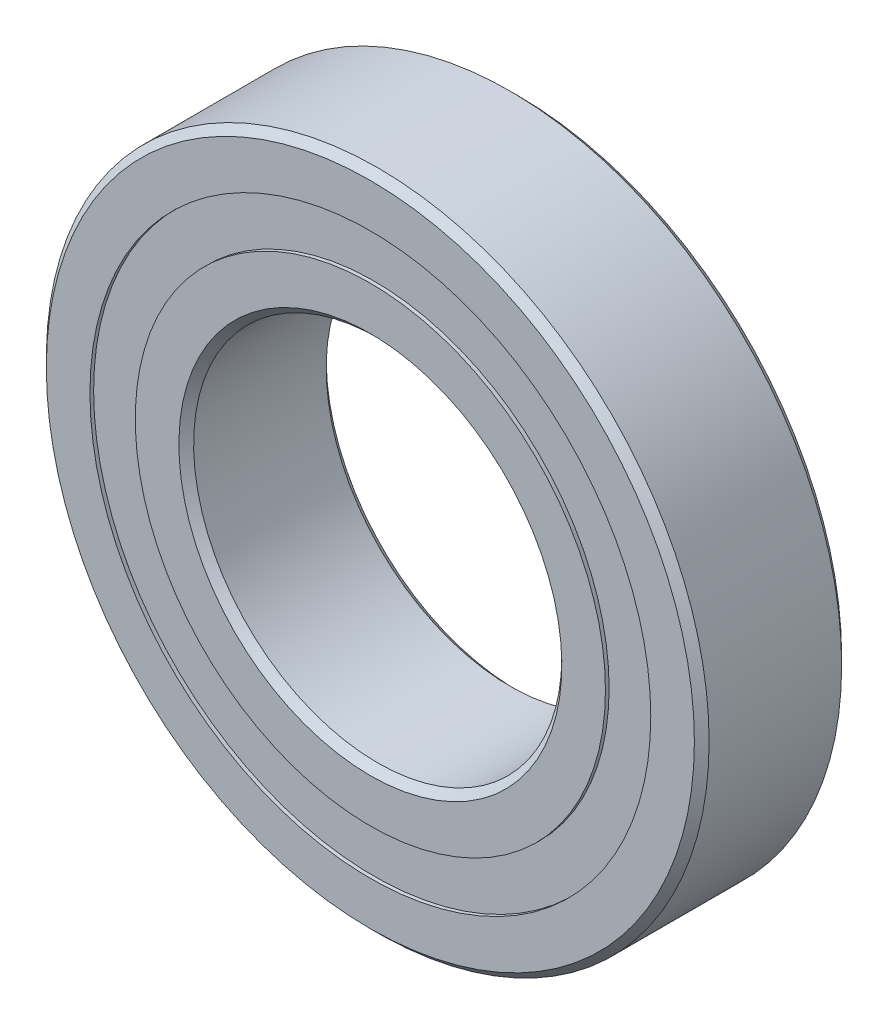
ISO-10303-21;
HEADER;
FILE_DESCRIPTION(('STEP AP214'),'2;1');
FILE_NAME('part.step','',(''),(''),'','','');
FILE_SCHEMA(('AUTOMOTIVE_DESIGN { 1 0 10303 214 1 1 1 1 }'));
ENDSEC;
DATA;
#1=APPLICATION_CONTEXT('core data for automotive mechanical design processes');
#2=APPLICATION_PROTOCOL_DEFINITION('international standard','automotive_design',2000,#1);
#3=PRODUCT_CONTEXT('',#1,'mechanical');
#4=PRODUCT('Part','Part','',(#3));
#5=PRODUCT_RELATED_PRODUCT_CATEGORY('part','',(#4));
#6=PRODUCT_DEFINITION_FORMATION('','',#4);
#7=PRODUCT_DEFINITION_CONTEXT('part definition',#1,'design');
#8=PRODUCT_DEFINITION('design','',#6,#7);
#9=PRODUCT_DEFINITION_SHAPE('','',#8);
#10=(LENGTH_UNIT() NAMED_UNIT(*) SI_UNIT(.MILLI.,.METRE.));
#11=(NAMED_UNIT(*) PLANE_ANGLE_UNIT() SI_UNIT($,.RADIAN.));
#12=(NAMED_UNIT(*) SI_UNIT($,.STERADIAN.) SOLID_ANGLE_UNIT());
#13=UNCERTAINTY_MEASURE_WITH_UNIT(LENGTH_MEASURE(1.E-05),#10,'distance_accuracy_value','');
#14=(GEOMETRIC_REPRESENTATION_CONTEXT(3) GLOBAL_UNCERTAINTY_ASSIGNED_CONTEXT((#13)) GLOBAL_UNIT_ASSIGNED_CONTEXT((#10,
#11,#12)) REPRESENTATION_CONTEXT('',''));
#15=CARTESIAN_POINT('',(0.,0.,0.));
#16=DIRECTION('',(0.,0.,1.));
#17=DIRECTION('',(1.,0.,0.));
#18=AXIS2_PLACEMENT_3D('',#15,#16,#17);
#19=CARTESIAN_POINT('',(-22.225,2.32794653101968E-13,0.));
#20=DIRECTION('',(-1.,0.,0.));
#21=DIRECTION('',(0.,0.,-1.));
#22=AXIS2_PLACEMENT_3D('',#19,#20,#21);
#23=SPHERICAL_SURFACE('',#22,3.43255780206311);
#24=CARTESIAN_POINT('',(-18.7924421979369,1.96840497746119E-13,0.));
#25=VERTEX_POINT('',#24);
#26=VERTEX_LOOP('',#25);
#27=FACE_BOUND('',#26,.T.);
#28=CARTESIAN_POINT('',(-25.6575578020631,2.68748808457817E-13,0.));
#29=VERTEX_POINT('',#28);
#30=VERTEX_LOOP('',#29);
#31=FACE_BOUND('',#30,.T.);
#32=ADVANCED_FACE('P0_F15',(#27,#31),#23,.T.);
#33=CLOSED_SHELL('',(#32));
#34=MANIFOLD_SOLID_BREP('P0_B1',#33);
#35=CARTESIAN_POINT('',(0.,24.1788461538462,-6.0325));
#36=DIRECTION('',(0.,0.,1.));
#37=DIRECTION('',(1.,0.,0.));
#38=AXIS2_PLACEMENT_3D('',#35,#36,#37);
#39=PLANE('',#38);
#40=CARTESIAN_POINT('',(0.,0.,-6.0325));
#41=DIRECTION('',(0.,0.,1.));
#42=DIRECTION('',(1.,0.,0.));
#43=AXIS2_PLACEMENT_3D('',#40,#41,#42);
#44=CIRCLE('',#43,20.2711538461538);
#45=CARTESIAN_POINT('',(20.2711538461538,0.,-6.0325));
#46=VERTEX_POINT('',#45);
#47=EDGE_CURVE('P1_E17',#46,#46,#44,.T.);
#48=ORIENTED_EDGE('',*,*,#47,.T.);
#49=EDGE_LOOP('',(#48));
#50=FACE_BOUND('',#49,.T.);
#51=CARTESIAN_POINT('',(0.,0.,-6.0325));
#52=DIRECTION('',(0.,0.,1.));
#53=DIRECTION('',(1.,0.,0.));
#54=AXIS2_PLACEMENT_3D('',#51,#52,#53);
#55=CIRCLE('',#54,24.1788461538462);
#56=CARTESIAN_POINT('',(24.1788461538462,0.,-6.0325));
#57=VERTEX_POINT('',#56);
#58=EDGE_CURVE('P1_E26',#57,#57,#55,.T.);
#59=ORIENTED_EDGE('',*,*,#58,.F.);
#60=EDGE_LOOP('',(#59));
#61=FACE_BOUND('',#60,.T.);
#62=ADVANCED_FACE('P1_F14',(#50,#61),#39,.F.);
#63=CARTESIAN_POINT('',(0.,0.,6.35));
#64=DIRECTION('',(0.,0.,1.));
#65=DIRECTION('',(1.,0.,0.));
#66=AXIS2_PLACEMENT_3D('',#63,#64,#65);
#67=CYLINDRICAL_SURFACE('',#66,20.2711538461538);
#68=ORIENTED_EDGE('',*,*,#47,.F.);
#69=EDGE_LOOP('',(#68));
#70=FACE_BOUND('',#69,.T.);
#71=CARTESIAN_POINT('',(0.,0.,-3.43255780206311));
#72=DIRECTION('',(0.,0.,1.));
#73=DIRECTION('',(1.,0.,0.));
#74=AXIS2_PLACEMENT_3D('',#71,#72,#73);
#75=CIRCLE('',#74,20.2711538461538);
#76=CARTESIAN_POINT('',(20.2711538461538,0.,-3.43255780206311));
#77=VERTEX_POINT('',#76);
#78=EDGE_CURVE('P1_E21',#77,#77,#75,.T.);
#79=ORIENTED_EDGE('',*,*,#78,.T.);
#80=EDGE_LOOP('',(#79));
#81=FACE_BOUND('',#80,.T.);
#82=ADVANCED_FACE('P1_F36',(#70,#81),#67,.F.);
#83=CARTESIAN_POINT('',(0.,0.,6.35));
#84=DIRECTION('',(0.,0.,1.));
#85=DIRECTION('',(1.,0.,0.));
#86=AXIS2_PLACEMENT_3D('',#83,#84,#85);
#87=CYLINDRICAL_SURFACE('',#86,24.1788461538462);
#88=CARTESIAN_POINT('',(0.,0.,-3.43255780206311));
#89=DIRECTION('',(0.,0.,1.));
#90=DIRECTION('',(1.,0.,0.));
#91=AXIS2_PLACEMENT_3D('',#88,#89,#90);
#92=CIRCLE('',#91,24.1788461538462);
#93=CARTESIAN_POINT('',(24.1788461538462,0.,-3.43255780206311));
#94=VERTEX_POINT('',#93);
#95=EDGE_CURVE('P1_E10',#94,#94,#92,.F.);
#96=ORIENTED_EDGE('',*,*,#95,.T.);
#97=EDGE_LOOP('',(#96));
#98=FACE_BOUND('',#97,.T.);
#99=ORIENTED_EDGE('',*,*,#58,.T.);
#100=EDGE_LOOP('',(#99));
#101=FACE_BOUND('',#100,.T.);
#102=ADVANCED_FACE('P1_F39',(#98,#101),#87,.T.);
#103=CARTESIAN_POINT('',(0.,24.1788461538462,-3.43255780206311));
#104=DIRECTION('',(0.,0.,-1.));
#105=DIRECTION('',(-1.,0.,0.));
#106=AXIS2_PLACEMENT_3D('',#103,#104,#105);
#107=PLANE('',#106);
#108=ORIENTED_EDGE('',*,*,#95,.F.);
#109=EDGE_LOOP('',(#108));
#110=FACE_BOUND('',#109,.T.);
#111=ORIENTED_EDGE('',*,*,#78,.F.);
#112=EDGE_LOOP('',(#111));
#113=FACE_BOUND('',#112,.T.);
#114=ADVANCED_FACE('P1_F42',(#110,#113),#107,.F.);
#115=CLOSED_SHELL('',(#62,#82,#102,#114));
#116=MANIFOLD_SOLID_BREP('P1_B1',#115);
#117=CARTESIAN_POINT('',(11.1125,19.2474145991091,0.));
#118=DIRECTION('',(0.500000000000001,0.866025403784438,0.));
#119=DIRECTION('',(0.,0.,-1.));
#120=AXIS2_PLACEMENT_3D('',#117,#118,#119);
#121=SPHERICAL_SURFACE('',#120,3.43255780206311);
#122=CARTESIAN_POINT('',(12.8287789010316,22.2200968556543,0.));
#123=VERTEX_POINT('',#122);
#124=VERTEX_LOOP('',#123);
#125=FACE_BOUND('',#124,.T.);
#126=CARTESIAN_POINT('',(9.39622109896846,16.274732342564,0.));
#127=VERTEX_POINT('',#126);
#128=VERTEX_LOOP('',#127);
#129=FACE_BOUND('',#128,.T.);
#130=ADVANCED_FACE('P2_F15',(#125,#129),#121,.T.);
#131=CLOSED_SHELL('',(#130));
#132=MANIFOLD_SOLID_BREP('P2_B1',#131);
#133=CARTESIAN_POINT('',(0.,22.225,0.));
#134=DIRECTION('',(0.,1.,0.));
#135=DIRECTION('',(0.,0.,-1.));
#136=AXIS2_PLACEMENT_3D('',#133,#134,#135);
#137=SPHERICAL_SURFACE('',#136,3.43255780206311);
#138=CARTESIAN_POINT('',(0.,25.6575578020631,0.));
#139=VERTEX_POINT('',#138);
#140=VERTEX_LOOP('',#139);
#141=FACE_BOUND('',#140,.T.);
#142=CARTESIAN_POINT('',(0.,18.7924421979369,0.));
#143=VERTEX_POINT('',#142);
#144=VERTEX_LOOP('',#143);
#145=FACE_BOUND('',#144,.T.);
#146=ADVANCED_FACE('P3_F15',(#141,#145),#137,.T.);
#147=CLOSED_SHELL('',(#146));
#148=MANIFOLD_SOLID_BREP('P3_B1',#147);
#149=CARTESIAN_POINT('',(-11.1125000000002,-19.2474145991091,0.));
#150=DIRECTION('',(-0.500000000000007,-0.866025403784435,0.));
#151=DIRECTION('',(0.,0.,-1.));
#152=AXIS2_PLACEMENT_3D('',#149,#150,#151);
#153=SPHERICAL_SURFACE('',#152,3.43255780206311);
#154=CARTESIAN_POINT('',(-12.8287789010317,-22.2200968556542,0.));
#155=VERTEX_POINT('',#154);
#156=VERTEX_LOOP('',#155);
#157=FACE_BOUND('',#156,.T.);
#158=CARTESIAN_POINT('',(-9.39622109896858,-16.2747323425639,0.));
#159=VERTEX_POINT('',#158);
#160=VERTEX_LOOP('',#159);
#161=FACE_BOUND('',#160,.T.);
#162=ADVANCED_FACE('P4_F15',(#157,#161),#153,.T.);
#163=CLOSED_SHELL('',(#162));
#164=MANIFOLD_SOLID_BREP('P4_B1',#163);
#165=CARTESIAN_POINT('',(-11.1124999999998,19.2474145991093,0.));
#166=DIRECTION('',(-0.499999999999989,0.866025403784445,0.));
#167=DIRECTION('',(0.,0.,-1.));
#168=AXIS2_PLACEMENT_3D('',#165,#166,#167);
#169=SPHERICAL_SURFACE('',#168,3.43255780206311);
#170=CARTESIAN_POINT('',(-12.8287789010313,22.2200968556544,0.));
#171=VERTEX_POINT('',#170);
#172=VERTEX_LOOP('',#171);
#173=FACE_BOUND('',#172,.T.);
#174=CARTESIAN_POINT('',(-9.39622109896824,16.2747323425641,0.));
#175=VERTEX_POINT('',#174);
#176=VERTEX_LOOP('',#175);
#177=FACE_BOUND('',#176,.T.);
#178=ADVANCED_FACE('P5_F15',(#173,#177),#169,.T.);
#179=CLOSED_SHELL('',(#178));
#180=MANIFOLD_SOLID_BREP('P5_B1',#179);
#181=CARTESIAN_POINT('',(0.,0.,0.));
#182=DIRECTION('',(0.,0.,1.));
#183=DIRECTION('',(1.,0.,0.));
#184=AXIS2_PLACEMENT_3D('',#181,#182,#183);
#185=TOROIDAL_SURFACE('',#184,22.225,3.43255780206311);
#186=CARTESIAN_POINT('',(0.,0.,2.82222222222222));
#187=DIRECTION('',(0.,0.,1.));
#188=DIRECTION('',(1.,0.,0.));
#189=AXIS2_PLACEMENT_3D('',#186,#187,#188);
#190=CIRCLE('',#189,20.2711538461538);
#191=CARTESIAN_POINT('',(20.2711538461538,0.,2.82222222222222));
#192=VERTEX_POINT('',#191);
#193=EDGE_CURVE('P6_E32',#192,#192,#190,.T.);
#194=ORIENTED_EDGE('',*,*,#193,.F.);
#195=EDGE_LOOP('',(#194));
#196=FACE_BOUND('',#195,.T.);
#197=CARTESIAN_POINT('',(0.,0.,-2.82222222222223));
#198=DIRECTION('',(0.,0.,1.));
#199=DIRECTION('',(1.,0.,0.));
#200=AXIS2_PLACEMENT_3D('',#197,#198,#199);
#201=CIRCLE('',#200,20.2711538461538);
#202=CARTESIAN_POINT('',(20.2711538461538,0.,-2.82222222222223));
#203=VERTEX_POINT('',#202);
#204=EDGE_CURVE('P6_E30',#203,#203,#201,.F.);
#205=ORIENTED_EDGE('',*,*,#204,.F.);
#206=EDGE_LOOP('',(#205));
#207=FACE_BOUND('',#206,.T.);
#208=ADVANCED_FACE('P6_F14',(#196,#207),#185,.F.);
#209=CARTESIAN_POINT('',(0.,0.,6.35));
#210=DIRECTION('',(0.,0.,1.));
#211=DIRECTION('',(1.,0.,0.));
#212=AXIS2_PLACEMENT_3D('',#209,#210,#211);
#213=CYLINDRICAL_SURFACE('',#212,20.2711538461538);
#214=CARTESIAN_POINT('',(0.,0.,6.35));
#215=DIRECTION('',(0.,0.,1.));
#216=DIRECTION('',(1.,0.,0.));
#217=AXIS2_PLACEMENT_3D('',#214,#215,#216);
#218=CIRCLE('',#217,20.2711538461538);
#219=CARTESIAN_POINT('',(20.2711538461538,0.,6.35));
#220=VERTEX_POINT('',#219);
#221=EDGE_CURVE('P6_E18',#220,#220,#218,.F.);
#222=ORIENTED_EDGE('',*,*,#221,.T.);
#223=EDGE_LOOP('',(#222));
#224=FACE_BOUND('',#223,.T.);
#225=ORIENTED_EDGE('',*,*,#193,.T.);
#226=EDGE_LOOP('',(#225));
#227=FACE_BOUND('',#226,.T.);
#228=ADVANCED_FACE('P6_F48',(#224,#227),#213,.T.);
#229=CARTESIAN_POINT('',(0.,0.,6.35));
#230=DIRECTION('',(0.,0.,1.));
#231=DIRECTION('',(1.,0.,0.));
#232=AXIS2_PLACEMENT_3D('',#229,#230,#231);
#233=CYLINDRICAL_SURFACE('',#232,20.2711538461538);
#234=ORIENTED_EDGE('',*,*,#204,.T.);
#235=EDGE_LOOP('',(#234));
#236=FACE_BOUND('',#235,.T.);
#237=CARTESIAN_POINT('',(0.,0.,-6.35));
#238=DIRECTION('',(0.,0.,1.));
#239=DIRECTION('',(1.,0.,0.));
#240=AXIS2_PLACEMENT_3D('',#237,#238,#239);
#241=CIRCLE('',#240,20.2711538461538);
#242=CARTESIAN_POINT('',(20.2711538461538,0.,-6.35));
#243=VERTEX_POINT('',#242);
#244=EDGE_CURVE('P6_E41',#243,#243,#241,.T.);
#245=ORIENTED_EDGE('',*,*,#244,.T.);
#246=EDGE_LOOP('',(#245));
#247=FACE_BOUND('',#246,.T.);
#248=ADVANCED_FACE('P6_F55',(#236,#247),#233,.T.);
#249=CARTESIAN_POINT('',(0.,20.2711538461538,6.35));
#250=DIRECTION('',(0.,0.,-1.));
#251=DIRECTION('',(-1.,0.,0.));
#252=AXIS2_PLACEMENT_3D('',#249,#250,#251);
#253=PLANE('',#252);
#254=ORIENTED_EDGE('',*,*,#221,.F.);
#255=EDGE_LOOP('',(#254));
#256=FACE_BOUND('',#255,.T.);
#257=CARTESIAN_POINT('',(0.,0.,6.35));
#258=DIRECTION('',(0.,0.,1.));
#259=DIRECTION('',(0.,-1.,0.));
#260=AXIS2_PLACEMENT_3D('',#257,#258,#259);
#261=CIRCLE('',#260,16.51);
#262=CARTESIAN_POINT('',(0.,-16.51,6.35));
#263=VERTEX_POINT('',#262);
#264=EDGE_CURVE('P6_E39',#263,#263,#261,.F.);
#265=ORIENTED_EDGE('',*,*,#264,.T.);
#266=EDGE_LOOP('',(#265));
#267=FACE_BOUND('',#266,.T.);
#268=ADVANCED_FACE('P6_F51',(#256,#267),#253,.F.);
#269=CARTESIAN_POINT('',(0.,16.51,-6.35));
#270=DIRECTION('',(0.,0.,1.));
#271=DIRECTION('',(1.,0.,0.));
#272=AXIS2_PLACEMENT_3D('',#269,#270,#271);
#273=PLANE('',#272);
#274=CARTESIAN_POINT('',(0.,0.,-6.35));
#275=DIRECTION('',(0.,0.,-1.));
#276=DIRECTION('',(0.,1.,0.));
#277=AXIS2_PLACEMENT_3D('',#274,#275,#276);
#278=CIRCLE('',#277,16.51);
#279=CARTESIAN_POINT('',(0.,16.51,-6.35));
#280=VERTEX_POINT('',#279);
#281=EDGE_CURVE('P6_E27',#280,#280,#278,.F.);
#282=ORIENTED_EDGE('',*,*,#281,.T.);
#283=EDGE_LOOP('',(#282));
#284=FACE_BOUND('',#283,.T.);
#285=ORIENTED_EDGE('',*,*,#244,.F.);
#286=EDGE_LOOP('',(#285));
#287=FACE_BOUND('',#286,.T.);
#288=ADVANCED_FACE('P6_F54',(#284,#287),#273,.F.);
#289=CARTESIAN_POINT('',(0.,0.,6.35));
#290=DIRECTION('',(0.,0.,1.));
#291=DIRECTION('',(0.,-1.,0.));
#292=AXIS2_PLACEMENT_3D('',#289,#290,#291);
#293=CONICAL_SURFACE('',#292,16.51,0.785398163397451);
#294=ORIENTED_EDGE('',*,*,#264,.F.);
#295=EDGE_LOOP('',(#294));
#296=FACE_BOUND('',#295,.T.);
#297=CARTESIAN_POINT('',(0.,0.,5.715));
#298=DIRECTION('',(0.,0.,1.));
#299=DIRECTION('',(1.,0.,0.));
#300=AXIS2_PLACEMENT_3D('',#297,#298,#299);
#301=CIRCLE('',#300,15.875);
#302=CARTESIAN_POINT('',(15.875,0.,5.715));
#303=VERTEX_POINT('',#302);
#304=EDGE_CURVE('P6_E22',#303,#303,#301,.F.);
#305=ORIENTED_EDGE('',*,*,#304,.T.);
#306=EDGE_LOOP('',(#305));
#307=FACE_BOUND('',#306,.T.);
#308=ADVANCED_FACE('P6_F59',(#296,#307),#293,.F.);
#309=CARTESIAN_POINT('',(0.,0.,-6.35));
#310=DIRECTION('',(0.,0.,-1.));
#311=DIRECTION('',(0.,1.,0.));
#312=AXIS2_PLACEMENT_3D('',#309,#310,#311);
#313=CONICAL_SURFACE('',#312,16.51,0.785398163397446);
#314=CARTESIAN_POINT('',(0.,0.,-5.715));
#315=DIRECTION('',(0.,0.,1.));
#316=DIRECTION('',(1.,0.,0.));
#317=AXIS2_PLACEMENT_3D('',#314,#315,#316);
#318=CIRCLE('',#317,15.875);
#319=CARTESIAN_POINT('',(15.875,0.,-5.715));
#320=VERTEX_POINT('',#319);
#321=EDGE_CURVE('P6_E10',#320,#320,#318,.T.);
#322=ORIENTED_EDGE('',*,*,#321,.T.);
#323=EDGE_LOOP('',(#322));
#324=FACE_BOUND('',#323,.T.);
#325=ORIENTED_EDGE('',*,*,#281,.F.);
#326=EDGE_LOOP('',(#325));
#327=FACE_BOUND('',#326,.T.);
#328=ADVANCED_FACE('P6_F62',(#324,#327),#313,.F.);
#329=CARTESIAN_POINT('',(0.,0.,6.35));
#330=DIRECTION('',(0.,0.,1.));
#331=DIRECTION('',(1.,0.,0.));
#332=AXIS2_PLACEMENT_3D('',#329,#330,#331);
#333=CYLINDRICAL_SURFACE('',#332,15.875);
#334=ORIENTED_EDGE('',*,*,#304,.F.);
#335=EDGE_LOOP('',(#334));
#336=FACE_BOUND('',#335,.T.);
#337=ORIENTED_EDGE('',*,*,#321,.F.);
#338=EDGE_LOOP('',(#337));
#339=FACE_BOUND('',#338,.T.);
#340=ADVANCED_FACE('P6_F66',(#336,#339),#333,.F.);
#341=CLOSED_SHELL('',(#208,#228,#248,#268,#288,#308,#328,#340));
#342=MANIFOLD_SOLID_BREP('P6_B1',#341);
#343=CARTESIAN_POINT('',(19.2474145991091,-11.1125000000001,0.));
#344=DIRECTION('',(0.866025403784436,-0.500000000000004,0.));
#345=DIRECTION('',(0.,0.,-1.));
#346=AXIS2_PLACEMENT_3D('',#343,#344,#345);
#347=SPHERICAL_SURFACE('',#346,3.43255780206311);
#348=CARTESIAN_POINT('',(22.2200968556542,-12.8287789010317,0.));
#349=VERTEX_POINT('',#348);
#350=VERTEX_LOOP('',#349);
#351=FACE_BOUND('',#350,.T.);
#352=CARTESIAN_POINT('',(16.274732342564,-9.39622109896852,0.));
#353=VERTEX_POINT('',#352);
#354=VERTEX_LOOP('',#353);
#355=FACE_BOUND('',#354,.T.);
#356=ADVANCED_FACE('P7_F15',(#351,#355),#347,.T.);
#357=CLOSED_SHELL('',(#356));
#358=MANIFOLD_SOLID_BREP('P7_B1',#357);
#359=CARTESIAN_POINT('',(0.,24.1788461538462,3.43255780206312));
#360=DIRECTION('',(0.,0.,1.));
#361=DIRECTION('',(1.,0.,0.));
#362=AXIS2_PLACEMENT_3D('',#359,#360,#361);
#363=PLANE('',#362);
#364=CARTESIAN_POINT('',(0.,0.,3.43255780206311));
#365=DIRECTION('',(0.,0.,1.));
#366=DIRECTION('',(1.,0.,0.));
#367=AXIS2_PLACEMENT_3D('',#364,#365,#366);
#368=CIRCLE('',#367,20.2711538461538);
#369=CARTESIAN_POINT('',(20.2711538461538,0.,3.43255780206311));
#370=VERTEX_POINT('',#369);
#371=EDGE_CURVE('P8_E17',#370,#370,#368,.T.);
#372=ORIENTED_EDGE('',*,*,#371,.T.);
#373=EDGE_LOOP('',(#372));
#374=FACE_BOUND('',#373,.T.);
#375=CARTESIAN_POINT('',(0.,0.,3.43255780206312));
#376=DIRECTION('',(0.,0.,1.));
#377=DIRECTION('',(1.,0.,0.));
#378=AXIS2_PLACEMENT_3D('',#375,#376,#377);
#379=CIRCLE('',#378,24.1788461538462);
#380=CARTESIAN_POINT('',(24.1788461538462,0.,3.43255780206312));
#381=VERTEX_POINT('',#380);
#382=EDGE_CURVE('P8_E26',#381,#381,#379,.T.);
#383=ORIENTED_EDGE('',*,*,#382,.F.);
#384=EDGE_LOOP('',(#383));
#385=FACE_BOUND('',#384,.T.);
#386=ADVANCED_FACE('P8_F14',(#374,#385),#363,.F.);
#387=CARTESIAN_POINT('',(0.,0.,6.35));
#388=DIRECTION('',(0.,0.,1.));
#389=DIRECTION('',(1.,0.,0.));
#390=AXIS2_PLACEMENT_3D('',#387,#388,#389);
#391=CYLINDRICAL_SURFACE('',#390,20.2711538461538);
#392=ORIENTED_EDGE('',*,*,#371,.F.);
#393=EDGE_LOOP('',(#392));
#394=FACE_BOUND('',#393,.T.);
#395=CARTESIAN_POINT('',(0.,0.,6.0325));
#396=DIRECTION('',(0.,0.,1.));
#397=DIRECTION('',(1.,0.,0.));
#398=AXIS2_PLACEMENT_3D('',#395,#396,#397);
#399=CIRCLE('',#398,20.2711538461538);
#400=CARTESIAN_POINT('',(20.2711538461538,0.,6.0325));
#401=VERTEX_POINT('',#400);
#402=EDGE_CURVE('P8_E21',#401,#401,#399,.T.);
#403=ORIENTED_EDGE('',*,*,#402,.T.);
#404=EDGE_LOOP('',(#403));
#405=FACE_BOUND('',#404,.T.);
#406=ADVANCED_FACE('P8_F36',(#394,#405),#391,.F.);
#407=CARTESIAN_POINT('',(0.,0.,6.35));
#408=DIRECTION('',(0.,0.,1.));
#409=DIRECTION('',(1.,0.,0.));
#410=AXIS2_PLACEMENT_3D('',#407,#408,#409);
#411=CYLINDRICAL_SURFACE('',#410,24.1788461538462);
#412=CARTESIAN_POINT('',(0.,0.,6.0325));
#413=DIRECTION('',(0.,0.,1.));
#414=DIRECTION('',(1.,0.,0.));
#415=AXIS2_PLACEMENT_3D('',#412,#413,#414);
#416=CIRCLE('',#415,24.1788461538462);
#417=CARTESIAN_POINT('',(24.1788461538462,0.,6.0325));
#418=VERTEX_POINT('',#417);
#419=EDGE_CURVE('P8_E10',#418,#418,#416,.F.);
#420=ORIENTED_EDGE('',*,*,#419,.T.);
#421=EDGE_LOOP('',(#420));
#422=FACE_BOUND('',#421,.T.);
#423=ORIENTED_EDGE('',*,*,#382,.T.);
#424=EDGE_LOOP('',(#423));
#425=FACE_BOUND('',#424,.T.);
#426=ADVANCED_FACE('P8_F39',(#422,#425),#411,.T.);
#427=CARTESIAN_POINT('',(0.,24.1788461538462,6.0325));
#428=DIRECTION('',(0.,0.,-1.));
#429=DIRECTION('',(-1.,0.,0.));
#430=AXIS2_PLACEMENT_3D('',#427,#428,#429);
#431=PLANE('',#430);
#432=ORIENTED_EDGE('',*,*,#419,.F.);
#433=EDGE_LOOP('',(#432));
#434=FACE_BOUND('',#433,.T.);
#435=ORIENTED_EDGE('',*,*,#402,.F.);
#436=EDGE_LOOP('',(#435));
#437=FACE_BOUND('',#436,.T.);
#438=ADVANCED_FACE('P8_F42',(#434,#437),#431,.F.);
#439=CLOSED_SHELL('',(#386,#406,#426,#438));
#440=MANIFOLD_SOLID_BREP('P8_B1',#439);
#441=CARTESIAN_POINT('',(-19.247414599109,11.1125000000002,0.));
#442=DIRECTION('',(-0.866025403784433,0.50000000000001,0.));
#443=DIRECTION('',(0.,0.,-1.));
#444=AXIS2_PLACEMENT_3D('',#441,#442,#443);
#445=SPHERICAL_SURFACE('',#444,3.43255780206311);
#446=CARTESIAN_POINT('',(-22.2200968556541,12.8287789010318,0.));
#447=VERTEX_POINT('',#446);
#448=VERTEX_LOOP('',#447);
#449=FACE_BOUND('',#448,.T.);
#450=CARTESIAN_POINT('',(-16.2747323425639,9.39622109896863,0.));
#451=VERTEX_POINT('',#450);
#452=VERTEX_LOOP('',#451);
#453=FACE_BOUND('',#452,.T.);
#454=ADVANCED_FACE('P9_F15',(#449,#453),#445,.T.);
#455=CLOSED_SHELL('',(#454));
#456=MANIFOLD_SOLID_BREP('P9_B1',#455);
#457=CARTESIAN_POINT('',(11.1124999999999,-19.2474145991092,0.));
#458=DIRECTION('',(0.499999999999995,-0.866025403784442,0.));
#459=DIRECTION('',(0.,0.,-1.));
#460=AXIS2_PLACEMENT_3D('',#457,#458,#459);
#461=SPHERICAL_SURFACE('',#460,3.43255780206311);
#462=CARTESIAN_POINT('',(12.8287789010314,-22.2200968556544,0.));
#463=VERTEX_POINT('',#462);
#464=VERTEX_LOOP('',#463);
#465=FACE_BOUND('',#464,.T.);
#466=CARTESIAN_POINT('',(9.39622109896835,-16.2747323425641,0.));
#467=VERTEX_POINT('',#466);
#468=VERTEX_LOOP('',#467);
#469=FACE_BOUND('',#468,.T.);
#470=ADVANCED_FACE('P10_F15',(#465,#469),#461,.T.);
#471=CLOSED_SHELL('',(#470));
#472=MANIFOLD_SOLID_BREP('P10_B1',#471);
#473=CARTESIAN_POINT('',(0.,0.,0.));
#474=DIRECTION('',(0.,0.,1.));
#475=DIRECTION('',(1.,0.,0.));
#476=AXIS2_PLACEMENT_3D('',#473,#474,#475);
#477=TOROIDAL_SURFACE('',#476,22.225,3.43255780206311);
#478=CARTESIAN_POINT('',(0.,0.,-2.82222222222222));
#479=DIRECTION('',(0.,0.,1.));
#480=DIRECTION('',(1.,0.,0.));
#481=AXIS2_PLACEMENT_3D('',#478,#479,#480);
#482=CIRCLE('',#481,24.1788461538462);
#483=CARTESIAN_POINT('',(24.1788461538462,0.,-2.82222222222222));
#484=VERTEX_POINT('',#483);
#485=EDGE_CURVE('P11_E32',#484,#484,#482,.F.);
#486=ORIENTED_EDGE('',*,*,#485,.T.);
#487=EDGE_LOOP('',(#486));
#488=FACE_BOUND('',#487,.T.);
#489=CARTESIAN_POINT('',(0.,0.,2.82222222222222));
#490=DIRECTION('',(0.,0.,1.));
#491=DIRECTION('',(1.,0.,0.));
#492=AXIS2_PLACEMENT_3D('',#489,#490,#491);
#493=CIRCLE('',#492,24.1788461538462);
#494=CARTESIAN_POINT('',(24.1788461538462,0.,2.82222222222222));
#495=VERTEX_POINT('',#494);
#496=EDGE_CURVE('P11_E30',#495,#495,#493,.T.);
#497=ORIENTED_EDGE('',*,*,#496,.T.);
#498=EDGE_LOOP('',(#497));
#499=FACE_BOUND('',#498,.T.);
#500=ADVANCED_FACE('P11_F14',(#488,#499),#477,.F.);
#501=CARTESIAN_POINT('',(0.,0.,6.35));
#502=DIRECTION('',(0.,0.,1.));
#503=DIRECTION('',(1.,0.,0.));
#504=AXIS2_PLACEMENT_3D('',#501,#502,#503);
#505=CYLINDRICAL_SURFACE('',#504,24.1788461538462);
#506=CARTESIAN_POINT('',(0.,0.,-6.35));
#507=DIRECTION('',(0.,0.,1.));
#508=DIRECTION('',(1.,0.,0.));
#509=AXIS2_PLACEMENT_3D('',#506,#507,#508);
#510=CIRCLE('',#509,24.1788461538462);
#511=CARTESIAN_POINT('',(24.1788461538462,0.,-6.35));
#512=VERTEX_POINT('',#511);
#513=EDGE_CURVE('P11_E18',#512,#512,#510,.F.);
#514=ORIENTED_EDGE('',*,*,#513,.T.);
#515=EDGE_LOOP('',(#514));
#516=FACE_BOUND('',#515,.T.);
#517=ORIENTED_EDGE('',*,*,#485,.F.);
#518=EDGE_LOOP('',(#517));
#519=FACE_BOUND('',#518,.T.);
#520=ADVANCED_FACE('P11_F48',(#516,#519),#505,.F.);
#521=CARTESIAN_POINT('',(0.,0.,6.35));
#522=DIRECTION('',(0.,0.,1.));
#523=DIRECTION('',(1.,0.,0.));
#524=AXIS2_PLACEMENT_3D('',#521,#522,#523);
#525=CYLINDRICAL_SURFACE('',#524,24.1788461538462);
#526=ORIENTED_EDGE('',*,*,#496,.F.);
#527=EDGE_LOOP('',(#526));
#528=FACE_BOUND('',#527,.T.);
#529=CARTESIAN_POINT('',(0.,0.,6.35));
#530=DIRECTION('',(0.,0.,1.));
#531=DIRECTION('',(1.,0.,0.));
#532=AXIS2_PLACEMENT_3D('',#529,#530,#531);
#533=CIRCLE('',#532,24.1788461538462);
#534=CARTESIAN_POINT('',(24.1788461538462,0.,6.35));
#535=VERTEX_POINT('',#534);
#536=EDGE_CURVE('P11_E41',#535,#535,#533,.T.);
#537=ORIENTED_EDGE('',*,*,#536,.T.);
#538=EDGE_LOOP('',(#537));
#539=FACE_BOUND('',#538,.T.);
#540=ADVANCED_FACE('P11_F55',(#528,#539),#525,.F.);
#541=CARTESIAN_POINT('',(0.,27.94,-6.35));
#542=DIRECTION('',(0.,0.,1.));
#543=DIRECTION('',(1.,0.,0.));
#544=AXIS2_PLACEMENT_3D('',#541,#542,#543);
#545=PLANE('',#544);
#546=ORIENTED_EDGE('',*,*,#513,.F.);
#547=EDGE_LOOP('',(#546));
#548=FACE_BOUND('',#547,.T.);
#549=CARTESIAN_POINT('',(0.,0.,-6.34999999999999));
#550=DIRECTION('',(0.,0.,1.));
#551=DIRECTION('',(1.,0.,0.));
#552=AXIS2_PLACEMENT_3D('',#549,#550,#551);
#553=CIRCLE('',#552,27.94);
#554=CARTESIAN_POINT('',(27.94,0.,-6.34999999999999));
#555=VERTEX_POINT('',#554);
#556=EDGE_CURVE('P11_E39',#555,#555,#553,.T.);
#557=ORIENTED_EDGE('',*,*,#556,.F.);
#558=EDGE_LOOP('',(#557));
#559=FACE_BOUND('',#558,.T.);
#560=ADVANCED_FACE('P11_F51',(#548,#559),#545,.F.);
#561=CARTESIAN_POINT('',(0.,27.94,6.35));
#562=DIRECTION('',(0.,0.,-1.));
#563=DIRECTION('',(-1.,0.,0.));
#564=AXIS2_PLACEMENT_3D('',#561,#562,#563);
#565=PLANE('',#564);
#566=CARTESIAN_POINT('',(0.,0.,6.35));
#567=DIRECTION('',(0.,0.,-1.));
#568=DIRECTION('',(0.,1.,0.));
#569=AXIS2_PLACEMENT_3D('',#566,#567,#568);
#570=CIRCLE('',#569,27.94);
#571=CARTESIAN_POINT('',(0.,27.94,6.35));
#572=VERTEX_POINT('',#571);
#573=EDGE_CURVE('P11_E27',#572,#572,#570,.T.);
#574=ORIENTED_EDGE('',*,*,#573,.F.);
#575=EDGE_LOOP('',(#574));
#576=FACE_BOUND('',#575,.T.);
#577=ORIENTED_EDGE('',*,*,#536,.F.);
#578=EDGE_LOOP('',(#577));
#579=FACE_BOUND('',#578,.T.);
#580=ADVANCED_FACE('P11_F54',(#576,#579),#565,.F.);
#581=CARTESIAN_POINT('',(0.,0.,-5.715));
#582=DIRECTION('',(0.,0.,1.));
#583=DIRECTION('',(1.,0.,0.));
#584=AXIS2_PLACEMENT_3D('',#581,#582,#583);
#585=CONICAL_SURFACE('',#584,28.575,0.785398163397447);
#586=CARTESIAN_POINT('',(0.,0.,-5.715));
#587=DIRECTION('',(0.,0.,1.));
#588=DIRECTION('',(1.,0.,0.));
#589=AXIS2_PLACEMENT_3D('',#586,#587,#588);
#590=CIRCLE('',#589,28.575);
#591=CARTESIAN_POINT('',(28.575,0.,-5.715));
#592=VERTEX_POINT('',#591);
#593=EDGE_CURVE('P11_E22',#592,#592,#590,.T.);
#594=ORIENTED_EDGE('',*,*,#593,.F.);
#595=EDGE_LOOP('',(#594));
#596=FACE_BOUND('',#595,.T.);
#597=ORIENTED_EDGE('',*,*,#556,.T.);
#598=EDGE_LOOP('',(#597));
#599=FACE_BOUND('',#598,.T.);
#600=ADVANCED_FACE('P11_F59',(#596,#599),#585,.T.);
#601=CARTESIAN_POINT('',(0.,0.,5.71500000000001));
#602=DIRECTION('',(0.,0.,-1.));
#603=DIRECTION('',(0.,1.,0.));
#604=AXIS2_PLACEMENT_3D('',#601,#602,#603);
#605=CONICAL_SURFACE('',#604,28.575,0.785398163397445);
#606=CARTESIAN_POINT('',(0.,0.,5.715));
#607=DIRECTION('',(0.,0.,1.));
#608=DIRECTION('',(1.,0.,0.));
#609=AXIS2_PLACEMENT_3D('',#606,#607,#608);
#610=CIRCLE('',#609,28.575);
#611=CARTESIAN_POINT('',(28.575,0.,5.715));
#612=VERTEX_POINT('',#611);
#613=EDGE_CURVE('P11_E10',#612,#612,#610,.F.);
#614=ORIENTED_EDGE('',*,*,#613,.F.);
#615=EDGE_LOOP('',(#614));
#616=FACE_BOUND('',#615,.T.);
#617=ORIENTED_EDGE('',*,*,#573,.T.);
#618=EDGE_LOOP('',(#617));
#619=FACE_BOUND('',#618,.T.);
#620=ADVANCED_FACE('P11_F61',(#616,#619),#605,.T.);
#621=CARTESIAN_POINT('',(0.,0.,6.35));
#622=DIRECTION('',(0.,0.,1.));
#623=DIRECTION('',(1.,0.,0.));
#624=AXIS2_PLACEMENT_3D('',#621,#622,#623);
#625=CYLINDRICAL_SURFACE('',#624,28.575);
#626=ORIENTED_EDGE('',*,*,#613,.T.);
#627=EDGE_LOOP('',(#626));
#628=FACE_BOUND('',#627,.T.);
#629=ORIENTED_EDGE('',*,*,#593,.T.);
#630=EDGE_LOOP('',(#629));
#631=FACE_BOUND('',#630,.T.);
#632=ADVANCED_FACE('P11_F69',(#628,#631),#625,.T.);
#633=CLOSED_SHELL('',(#500,#520,#540,#560,#580,#600,#620,#632));
#634=MANIFOLD_SOLID_BREP('P11_B1',#633);
#635=CARTESIAN_POINT('',(19.2474145991092,11.1125,0.));
#636=DIRECTION('',(0.86602540378444,0.499999999999998,0.));
#637=DIRECTION('',(0.,0.,-1.));
#638=AXIS2_PLACEMENT_3D('',#635,#636,#637);
#639=SPHERICAL_SURFACE('',#638,3.43255780206311);
#640=CARTESIAN_POINT('',(22.2200968556543,12.8287789010315,0.));
#641=VERTEX_POINT('',#640);
#642=VERTEX_LOOP('',#641);
#643=FACE_BOUND('',#642,.T.);
#644=CARTESIAN_POINT('',(16.274732342564,9.39622109896841,0.));
#645=VERTEX_POINT('',#644);
#646=VERTEX_LOOP('',#645);
#647=FACE_BOUND('',#646,.T.);
#648=ADVANCED_FACE('P12_F15',(#643,#647),#639,.T.);
#649=CLOSED_SHELL('',(#648));
#650=MANIFOLD_SOLID_BREP('P12_B1',#649);
#651=CARTESIAN_POINT('',(-19.2474145991093,-11.1124999999998,0.));
#652=DIRECTION('',(-0.866025403784443,-0.499999999999992,0.));
#653=DIRECTION('',(0.,0.,-1.));
#654=AXIS2_PLACEMENT_3D('',#651,#652,#653);
#655=SPHERICAL_SURFACE('',#654,3.43255780206311);
#656=CARTESIAN_POINT('',(-22.2200968556544,-12.8287789010314,0.));
#657=VERTEX_POINT('',#656);
#658=VERTEX_LOOP('',#657);
#659=FACE_BOUND('',#658,.T.);
#660=CARTESIAN_POINT('',(-16.2747323425641,-9.39622109896829,0.));
#661=VERTEX_POINT('',#660);
#662=VERTEX_LOOP('',#661);
#663=FACE_BOUND('',#662,.T.);
#664=ADVANCED_FACE('P13_F15',(#659,#663),#655,.T.);
#665=CLOSED_SHELL('',(#664));
#666=MANIFOLD_SOLID_BREP('P13_B1',#665);
#667=CARTESIAN_POINT('',(-1.55196435401312E-13,-22.225,0.));
#668=DIRECTION('',(0.,-1.,0.));
#669=DIRECTION('',(0.,0.,-1.));
#670=AXIS2_PLACEMENT_3D('',#667,#668,#669);
#671=SPHERICAL_SURFACE('',#670,3.43255780206311);
#672=CARTESIAN_POINT('',(-1.31226998497413E-13,-18.7924421979369,0.));
#673=VERTEX_POINT('',#672);
#674=VERTEX_LOOP('',#673);
#675=FACE_BOUND('',#674,.T.);
#676=CARTESIAN_POINT('',(-1.79165872305211E-13,-25.6575578020631,0.));
#677=VERTEX_POINT('',#676);
#678=VERTEX_LOOP('',#677);
#679=FACE_BOUND('',#678,.T.);
#680=ADVANCED_FACE('P14_F15',(#675,#679),#671,.T.);
#681=CLOSED_SHELL('',(#680));
#682=MANIFOLD_SOLID_BREP('P14_B1',#681);
#683=CARTESIAN_POINT('',(22.225,0.,0.));
#684=DIRECTION('',(1.,0.,0.));
#685=DIRECTION('',(0.,0.,-1.));
#686=AXIS2_PLACEMENT_3D('',#683,#684,#685);
#687=SPHERICAL_SURFACE('',#686,3.43255780206311);
#688=CARTESIAN_POINT('',(25.6575578020631,0.,0.));
#689=VERTEX_POINT('',#688);
#690=VERTEX_LOOP('',#689);
#691=FACE_BOUND('',#690,.T.);
#692=CARTESIAN_POINT('',(18.7924421979369,0.,0.));
#693=VERTEX_POINT('',#692);
#694=VERTEX_LOOP('',#693);
#695=FACE_BOUND('',#694,.T.);
#696=ADVANCED_FACE('P15_F15',(#691,#695),#687,.T.);
#697=CLOSED_SHELL('',(#696));
#698=MANIFOLD_SOLID_BREP('P15_B1',#697);
#699=ADVANCED_BREP_SHAPE_REPRESENTATION('',(#18,#34,#116,#132,#148,#164,#180,#342,#358,#440,
#456,#472,#634,#650,#666,#682,#698),#14);
#700=SHAPE_DEFINITION_REPRESENTATION(#9,#699);
ENDSEC;
END-ISO-10303-21;
